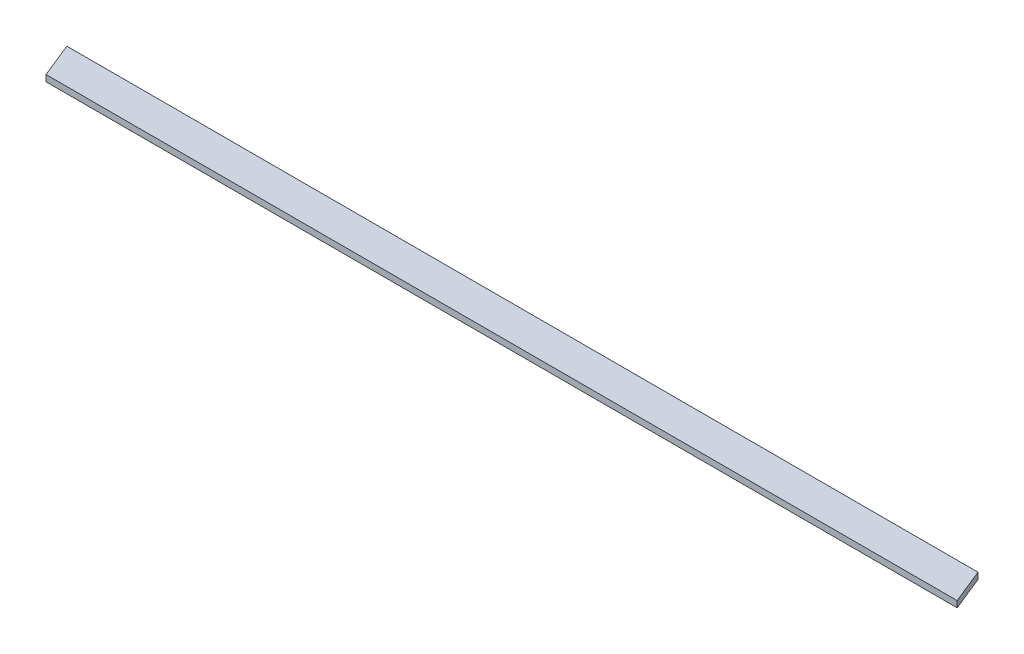
ISO-10303-21;
HEADER;
FILE_DESCRIPTION(('STEP AP214'),'2;1');
FILE_NAME('part.step','',(''),(''),'','','');
FILE_SCHEMA(('AUTOMOTIVE_DESIGN { 1 0 10303 214 1 1 1 1 }'));
ENDSEC;
DATA;
#1=APPLICATION_CONTEXT('core data for automotive mechanical design processes');
#2=APPLICATION_PROTOCOL_DEFINITION('international standard','automotive_design',2000,#1);
#3=PRODUCT_CONTEXT('',#1,'mechanical');
#4=PRODUCT('Part','Part','',(#3));
#5=PRODUCT_RELATED_PRODUCT_CATEGORY('part','',(#4));
#6=PRODUCT_DEFINITION_FORMATION('','',#4);
#7=PRODUCT_DEFINITION_CONTEXT('part definition',#1,'design');
#8=PRODUCT_DEFINITION('design','',#6,#7);
#9=PRODUCT_DEFINITION_SHAPE('','',#8);
#10=(LENGTH_UNIT() NAMED_UNIT(*) SI_UNIT(.MILLI.,.METRE.));
#11=(NAMED_UNIT(*) PLANE_ANGLE_UNIT() SI_UNIT($,.RADIAN.));
#12=(NAMED_UNIT(*) SI_UNIT($,.STERADIAN.) SOLID_ANGLE_UNIT());
#13=UNCERTAINTY_MEASURE_WITH_UNIT(LENGTH_MEASURE(1.E-05),#10,'distance_accuracy_value','');
#14=(GEOMETRIC_REPRESENTATION_CONTEXT(3) GLOBAL_UNCERTAINTY_ASSIGNED_CONTEXT((#13)) GLOBAL_UNIT_ASSIGNED_CONTEXT((#10,
#11,#12)) REPRESENTATION_CONTEXT('',''));
#15=CARTESIAN_POINT('',(0.,0.,0.));
#16=DIRECTION('',(0.,0.,1.));
#17=DIRECTION('',(1.,0.,0.));
#18=AXIS2_PLACEMENT_3D('',#15,#16,#17);
#19=CARTESIAN_POINT('',(0.,5.715,0.));
#20=DIRECTION('',(0.,0.,-1.));
#21=DIRECTION('',(1.,0.,0.));
#22=AXIS2_PLACEMENT_3D('',#19,#20,#21);
#23=PLANE('',#22);
#24=DIRECTION('',(-1.,0.,0.));
#25=VECTOR('',#24,1.);
#26=CARTESIAN_POINT('',(0.,-5.71500000000001,0.));
#27=LINE('',#26,#25);
#28=CARTESIAN_POINT('',(0.,-5.71500000000001,0.));
#29=VERTEX_POINT('',#28);
#30=CARTESIAN_POINT('',(-1654.175,-5.71500000000001,-7.21644966006352E-13));
#31=VERTEX_POINT('',#30);
#32=EDGE_CURVE('E97',#29,#31,#27,.T.);
#33=ORIENTED_EDGE('',*,*,#32,.F.);
#34=DIRECTION('',(0.,-1.,0.));
#35=VECTOR('',#34,1.);
#36=CARTESIAN_POINT('',(0.,5.715,0.));
#37=LINE('',#36,#35);
#38=CARTESIAN_POINT('',(0.,5.715,0.));
#39=VERTEX_POINT('',#38);
#40=EDGE_CURVE('E96',#39,#29,#37,.T.);
#41=ORIENTED_EDGE('',*,*,#40,.F.);
#42=DIRECTION('',(-1.,0.,0.));
#43=VECTOR('',#42,1.);
#44=CARTESIAN_POINT('',(0.,5.715,0.));
#45=LINE('',#44,#43);
#46=CARTESIAN_POINT('',(-1654.175,5.715,-7.21644966006352E-13));
#47=VERTEX_POINT('',#46);
#48=EDGE_CURVE('E91',#39,#47,#45,.T.);
#49=ORIENTED_EDGE('',*,*,#48,.T.);
#50=DIRECTION('',(0.,-1.,0.));
#51=VECTOR('',#50,1.);
#52=CARTESIAN_POINT('',(-1654.175,5.715,-7.21644966006352E-13));
#53=LINE('',#52,#51);
#54=EDGE_CURVE('E11',#47,#31,#53,.T.);
#55=ORIENTED_EDGE('',*,*,#54,.T.);
#56=EDGE_LOOP('',(#33,#41,#49,#55));
#57=FACE_BOUND('',#56,.T.);
#58=ADVANCED_FACE('F34',(#57),#23,.F.);
#59=CARTESIAN_POINT('',(-1654.175,5.715,-7.21644966006352E-13));
#60=DIRECTION('',(0.927183854566787,0.,-0.374606593415911));
#61=DIRECTION('',(0.374606593415912,0.,0.927183854566787));
#62=AXIS2_PLACEMENT_3D('',#59,#60,#61);
#63=PLANE('',#62);
#64=DIRECTION('',(-0.374606593415912,0.,-0.927183854566787));
#65=VECTOR('',#64,1.);
#66=CARTESIAN_POINT('',(-1654.175,-5.71500000000001,-7.21644966006352E-13));
#67=LINE('',#66,#65);
#68=CARTESIAN_POINT('',(-1679.83066534053,-5.71500000000001,-63.5000000000007));
#69=VERTEX_POINT('',#68);
#70=EDGE_CURVE('E99',#31,#69,#67,.T.);
#71=ORIENTED_EDGE('',*,*,#70,.F.);
#72=ORIENTED_EDGE('',*,*,#54,.F.);
#73=DIRECTION('',(-0.374606593415912,0.,-0.927183854566787));
#74=VECTOR('',#73,1.);
#75=CARTESIAN_POINT('',(-1654.175,5.715,-7.21644966006352E-13));
#76=LINE('',#75,#74);
#77=CARTESIAN_POINT('',(-1679.83066534053,5.71499999999999,-63.5000000000007));
#78=VERTEX_POINT('',#77);
#79=EDGE_CURVE('E75',#47,#78,#76,.T.);
#80=ORIENTED_EDGE('',*,*,#79,.T.);
#81=DIRECTION('',(0.,-1.,0.));
#82=VECTOR('',#81,1.);
#83=CARTESIAN_POINT('',(-1679.83066534053,5.71499999999999,-63.5000000000007));
#84=LINE('',#83,#82);
#85=EDGE_CURVE('E42',#78,#69,#84,.T.);
#86=ORIENTED_EDGE('',*,*,#85,.T.);
#87=EDGE_LOOP('',(#71,#72,#80,#86));
#88=FACE_BOUND('',#87,.T.);
#89=ADVANCED_FACE('F89',(#88),#63,.F.);
#90=CARTESIAN_POINT('',(-1679.83066534053,5.71499999999999,-63.5000000000007));
#91=DIRECTION('',(0.,0.,1.));
#92=DIRECTION('',(-1.,0.,0.));
#93=AXIS2_PLACEMENT_3D('',#90,#91,#92);
#94=PLANE('',#93);
#95=DIRECTION('',(1.,0.,0.));
#96=VECTOR('',#95,1.);
#97=CARTESIAN_POINT('',(-1679.83066534053,-5.71500000000001,-63.5000000000007));
#98=LINE('',#97,#96);
#99=CARTESIAN_POINT('',(-25.6556653405325,-5.715,-63.5));
#100=VERTEX_POINT('',#99);
#101=EDGE_CURVE('E85',#69,#100,#98,.T.);
#102=ORIENTED_EDGE('',*,*,#101,.F.);
#103=ORIENTED_EDGE('',*,*,#85,.F.);
#104=DIRECTION('',(1.,0.,0.));
#105=VECTOR('',#104,1.);
#106=CARTESIAN_POINT('',(-1679.83066534053,5.71499999999999,-63.5000000000007));
#107=LINE('',#106,#105);
#108=CARTESIAN_POINT('',(-25.6556653405325,5.71499999999999,-63.5));
#109=VERTEX_POINT('',#108);
#110=EDGE_CURVE('E78',#78,#109,#107,.T.);
#111=ORIENTED_EDGE('',*,*,#110,.T.);
#112=DIRECTION('',(0.,-1.,0.));
#113=VECTOR('',#112,1.);
#114=CARTESIAN_POINT('',(-25.6556653405325,5.71499999999999,-63.5));
#115=LINE('',#114,#113);
#116=EDGE_CURVE('E88',#109,#100,#115,.T.);
#117=ORIENTED_EDGE('',*,*,#116,.T.);
#118=EDGE_LOOP('',(#102,#103,#111,#117));
#119=FACE_BOUND('',#118,.T.);
#120=ADVANCED_FACE('F84',(#119),#94,.F.);
#121=CARTESIAN_POINT('',(0.,5.715,0.));
#122=DIRECTION('',(-0.927183854566787,0.,0.374606593415912));
#123=DIRECTION('',(-0.374606593415913,0.,-0.927183854566787));
#124=AXIS2_PLACEMENT_3D('',#121,#122,#123);
#125=PLANE('',#124);
#126=DIRECTION('',(0.374606593415913,0.,0.927183854566787));
#127=VECTOR('',#126,1.);
#128=CARTESIAN_POINT('',(0.,-5.71500000000001,0.));
#129=LINE('',#128,#127);
#130=EDGE_CURVE('E64',#100,#29,#129,.T.);
#131=ORIENTED_EDGE('',*,*,#130,.F.);
#132=ORIENTED_EDGE('',*,*,#116,.F.);
#133=DIRECTION('',(0.374606593415913,0.,0.927183854566787));
#134=VECTOR('',#133,1.);
#135=CARTESIAN_POINT('',(0.,5.715,0.));
#136=LINE('',#135,#134);
#137=EDGE_CURVE('E50',#109,#39,#136,.T.);
#138=ORIENTED_EDGE('',*,*,#137,.T.);
#139=ORIENTED_EDGE('',*,*,#40,.T.);
#140=EDGE_LOOP('',(#131,#132,#138,#139));
#141=FACE_BOUND('',#140,.T.);
#142=ADVANCED_FACE('F108',(#141),#125,.F.);
#143=CARTESIAN_POINT('',(0.,5.715,0.));
#144=DIRECTION('',(0.,1.,0.));
#145=DIRECTION('',(0.,0.,-1.));
#146=AXIS2_PLACEMENT_3D('',#143,#144,#145);
#147=PLANE('',#146);
#148=ORIENTED_EDGE('',*,*,#48,.F.);
#149=ORIENTED_EDGE('',*,*,#137,.F.);
#150=ORIENTED_EDGE('',*,*,#110,.F.);
#151=ORIENTED_EDGE('',*,*,#79,.F.);
#152=EDGE_LOOP('',(#148,#149,#150,#151));
#153=FACE_BOUND('',#152,.T.);
#154=ADVANCED_FACE('F80',(#153),#147,.T.);
#155=CARTESIAN_POINT('',(0.,-5.71500000000001,0.));
#156=DIRECTION('',(0.,1.,0.));
#157=DIRECTION('',(0.,0.,-1.));
#158=AXIS2_PLACEMENT_3D('',#155,#156,#157);
#159=PLANE('',#158);
#160=ORIENTED_EDGE('',*,*,#32,.T.);
#161=ORIENTED_EDGE('',*,*,#70,.T.);
#162=ORIENTED_EDGE('',*,*,#101,.T.);
#163=ORIENTED_EDGE('',*,*,#130,.T.);
#164=EDGE_LOOP('',(#160,#161,#162,#163));
#165=FACE_BOUND('',#164,.T.);
#166=ADVANCED_FACE('F104',(#165),#159,.F.);
#167=CLOSED_SHELL('',(#58,#89,#120,#142,#154,#166));
#168=MANIFOLD_SOLID_BREP('B2',#167);
#169=ADVANCED_BREP_SHAPE_REPRESENTATION('',(#18,#168),#14);
#170=SHAPE_DEFINITION_REPRESENTATION(#9,#169);
ENDSEC;
END-ISO-10303-21;
